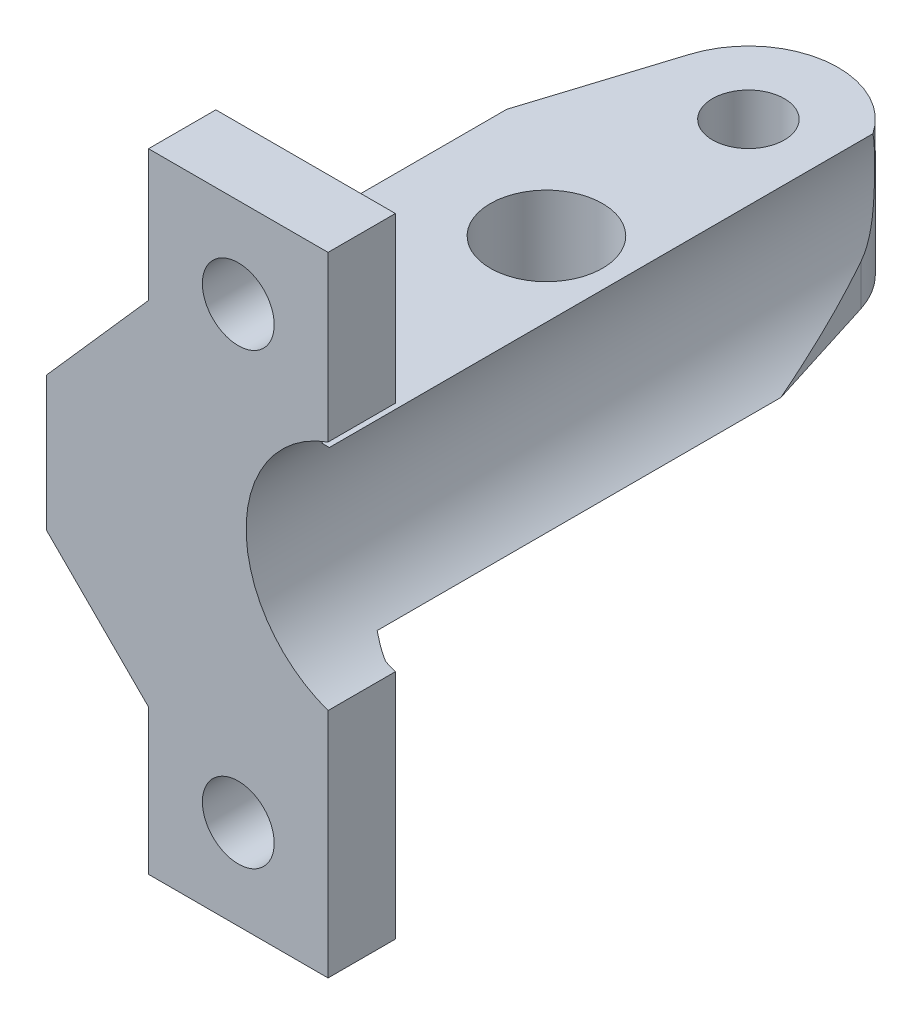
ISO-10303-21;
HEADER;
FILE_DESCRIPTION(('STEP AP214'),'2;1');
FILE_NAME('part.step','',(''),(''),'','','');
FILE_SCHEMA(('AUTOMOTIVE_DESIGN { 1 0 10303 214 1 1 1 1 }'));
ENDSEC;
DATA;
#1=APPLICATION_CONTEXT('core data for automotive mechanical design processes');
#2=APPLICATION_PROTOCOL_DEFINITION('international standard','automotive_design',2000,#1);
#3=PRODUCT_CONTEXT('',#1,'mechanical');
#4=PRODUCT('Part','Part','',(#3));
#5=PRODUCT_RELATED_PRODUCT_CATEGORY('part','',(#4));
#6=PRODUCT_DEFINITION_FORMATION('','',#4);
#7=PRODUCT_DEFINITION_CONTEXT('part definition',#1,'design');
#8=PRODUCT_DEFINITION('design','',#6,#7);
#9=PRODUCT_DEFINITION_SHAPE('','',#8);
#10=(LENGTH_UNIT() NAMED_UNIT(*) SI_UNIT(.MILLI.,.METRE.));
#11=(NAMED_UNIT(*) PLANE_ANGLE_UNIT() SI_UNIT($,.RADIAN.));
#12=(NAMED_UNIT(*) SI_UNIT($,.STERADIAN.) SOLID_ANGLE_UNIT());
#13=UNCERTAINTY_MEASURE_WITH_UNIT(LENGTH_MEASURE(1.E-05),#10,'distance_accuracy_value','');
#14=(GEOMETRIC_REPRESENTATION_CONTEXT(3) GLOBAL_UNCERTAINTY_ASSIGNED_CONTEXT((#13)) GLOBAL_UNIT_ASSIGNED_CONTEXT((#10,
#11,#12)) REPRESENTATION_CONTEXT('',''));
#15=CARTESIAN_POINT('',(0.,0.,0.));
#16=DIRECTION('',(0.,0.,1.));
#17=DIRECTION('',(1.,0.,0.));
#18=AXIS2_PLACEMENT_3D('',#15,#16,#17);
#19=CARTESIAN_POINT('',(0.,0.,3.));
#20=DIRECTION('',(-1.,0.,0.));
#21=DIRECTION('',(0.,-1.,0.));
#22=AXIS2_PLACEMENT_3D('',#19,#20,#21);
#23=PLANE('',#22);
#24=DIRECTION('',(0.,1.,0.));
#25=VECTOR('',#24,1.);
#26=CARTESIAN_POINT('',(0.,0.,0.));
#27=LINE('',#26,#25);
#28=CARTESIAN_POINT('',(0.,-28.,0.));
#29=VERTEX_POINT('',#28);
#30=CARTESIAN_POINT('',(0.,-17.6795270054321,0.));
#31=VERTEX_POINT('',#30);
#32=EDGE_CURVE('E199',#29,#31,#27,.T.);
#33=ORIENTED_EDGE('',*,*,#32,.T.);
#34=DIRECTION('',(0.,0.,1.));
#35=VECTOR('',#34,1.);
#36=CARTESIAN_POINT('',(0.,-17.6795270054321,-26.5));
#37=LINE('',#36,#35);
#38=CARTESIAN_POINT('',(0.,-17.6795270054321,3.));
#39=VERTEX_POINT('',#38);
#40=EDGE_CURVE('E130',#31,#39,#37,.T.);
#41=ORIENTED_EDGE('',*,*,#40,.T.);
#42=DIRECTION('',(0.,1.,0.));
#43=VECTOR('',#42,1.);
#44=CARTESIAN_POINT('',(0.,0.,3.));
#45=LINE('',#44,#43);
#46=CARTESIAN_POINT('',(0.,-28.,3.));
#47=VERTEX_POINT('',#46);
#48=EDGE_CURVE('E184',#47,#39,#45,.T.);
#49=ORIENTED_EDGE('',*,*,#48,.F.);
#50=DIRECTION('',(0.,0.,-1.));
#51=VECTOR('',#50,1.);
#52=CARTESIAN_POINT('',(0.,-28.,3.));
#53=LINE('',#52,#51);
#54=EDGE_CURVE('E198',#47,#29,#53,.T.);
#55=ORIENTED_EDGE('',*,*,#54,.T.);
#56=EDGE_LOOP('',(#33,#41,#49,#55));
#57=FACE_BOUND('',#56,.T.);
#58=ADVANCED_FACE('F37',(#57),#23,.F.);
#59=CARTESIAN_POINT('',(0.,0.,0.));
#60=DIRECTION('',(0.,0.,-1.));
#61=DIRECTION('',(-1.,0.,0.));
#62=AXIS2_PLACEMENT_3D('',#59,#60,#61);
#63=PLANE('',#62);
#64=CARTESIAN_POINT('',(-4.,-4.,0.));
#65=DIRECTION('',(0.,0.,-1.));
#66=DIRECTION('',(-1.,0.,0.));
#67=AXIS2_PLACEMENT_3D('',#64,#65,#66);
#68=CIRCLE('',#67,1.6);
#69=CARTESIAN_POINT('',(-5.6,-4.,0.));
#70=VERTEX_POINT('',#69);
#71=EDGE_CURVE('E581',#70,#70,#68,.T.);
#72=ORIENTED_EDGE('',*,*,#71,.F.);
#73=EDGE_LOOP('',(#72));
#74=FACE_BOUND('',#73,.T.);
#75=CARTESIAN_POINT('',(1.84999999999999,-12.5,0.));
#76=DIRECTION('',(0.,0.,-1.));
#77=DIRECTION('',(-1.,0.,0.));
#78=AXIS2_PLACEMENT_3D('',#75,#76,#77);
#79=CIRCLE('',#78,5.5);
#80=CARTESIAN_POINT('',(-3.2734753829798,-10.5,0.));
#81=VERTEX_POINT('',#80);
#82=CARTESIAN_POINT('',(0.,-7.32047299456794,0.));
#83=VERTEX_POINT('',#82);
#84=EDGE_CURVE('E120',#81,#83,#79,.T.);
#85=ORIENTED_EDGE('',*,*,#84,.F.);
#86=DIRECTION('',(-1.,0.,0.));
#87=VECTOR('',#86,1.);
#88=CARTESIAN_POINT('',(-12.54,-10.5,0.));
#89=LINE('',#88,#87);
#90=CARTESIAN_POINT('',(-12.0987401965084,-10.5,0.));
#91=VERTEX_POINT('',#90);
#92=EDGE_CURVE('E61',#81,#91,#89,.T.);
#93=ORIENTED_EDGE('',*,*,#92,.T.);
#94=DIRECTION('',(-0.661691894916747,-0.749775857307692,0.));
#95=VECTOR('',#94,1.);
#96=CARTESIAN_POINT('',(-12.54,-11.,0.));
#97=LINE('',#96,#95);
#98=CARTESIAN_POINT('',(-8.,-5.85563837440506,0.));
#99=VERTEX_POINT('',#98);
#100=EDGE_CURVE('E345',#99,#91,#97,.T.);
#101=ORIENTED_EDGE('',*,*,#100,.F.);
#102=DIRECTION('',(0.,-1.,0.));
#103=VECTOR('',#102,1.);
#104=CARTESIAN_POINT('',(-8.,0.,0.));
#105=LINE('',#104,#103);
#106=CARTESIAN_POINT('',(-8.,0.,0.));
#107=VERTEX_POINT('',#106);
#108=EDGE_CURVE('E206',#107,#99,#105,.T.);
#109=ORIENTED_EDGE('',*,*,#108,.F.);
#110=DIRECTION('',(-1.,0.,0.));
#111=VECTOR('',#110,1.);
#112=CARTESIAN_POINT('',(0.,0.,0.));
#113=LINE('',#112,#111);
#114=CARTESIAN_POINT('',(0.,0.,0.));
#115=VERTEX_POINT('',#114);
#116=EDGE_CURVE('E202',#115,#107,#113,.T.);
#117=ORIENTED_EDGE('',*,*,#116,.F.);
#118=EDGE_CURVE('E183',#83,#115,#27,.T.);
#119=ORIENTED_EDGE('',*,*,#118,.F.);
#120=EDGE_LOOP('',(#85,#93,#101,#109,#117,#119));
#121=FACE_BOUND('',#120,.T.);
#122=ADVANCED_FACE('F273',(#74,#121),#63,.T.);
#123=CARTESIAN_POINT('',(-8.,0.,3.));
#124=DIRECTION('',(1.,0.,0.));
#125=DIRECTION('',(0.,1.,0.));
#126=AXIS2_PLACEMENT_3D('',#123,#124,#125);
#127=PLANE('',#126);
#128=DIRECTION('',(0.,-1.,0.));
#129=VECTOR('',#128,1.);
#130=CARTESIAN_POINT('',(-8.,0.,3.));
#131=LINE('',#130,#129);
#132=CARTESIAN_POINT('',(-8.,-21.54,3.));
#133=VERTEX_POINT('',#132);
#134=CARTESIAN_POINT('',(-8.,-28.,3.));
#135=VERTEX_POINT('',#134);
#136=EDGE_CURVE('E191',#133,#135,#131,.T.);
#137=ORIENTED_EDGE('',*,*,#136,.F.);
#138=DIRECTION('',(0.,0.,1.));
#139=VECTOR('',#138,1.);
#140=CARTESIAN_POINT('',(-8.,-21.54,-16.3282209564433));
#141=LINE('',#140,#139);
#142=CARTESIAN_POINT('',(-8.,-21.54,0.));
#143=VERTEX_POINT('',#142);
#144=EDGE_CURVE('E336',#143,#133,#141,.T.);
#145=ORIENTED_EDGE('',*,*,#144,.F.);
#146=CARTESIAN_POINT('',(-8.,-28.,0.));
#147=VERTEX_POINT('',#146);
#148=EDGE_CURVE('E205',#143,#147,#105,.T.);
#149=ORIENTED_EDGE('',*,*,#148,.T.);
#150=DIRECTION('',(0.,0.,-1.));
#151=VECTOR('',#150,1.);
#152=CARTESIAN_POINT('',(-8.,-28.,3.));
#153=LINE('',#152,#151);
#154=EDGE_CURVE('E214',#135,#147,#153,.T.);
#155=ORIENTED_EDGE('',*,*,#154,.F.);
#156=EDGE_LOOP('',(#137,#145,#149,#155));
#157=FACE_BOUND('',#156,.T.);
#158=ADVANCED_FACE('F280',(#157),#127,.F.);
#159=CARTESIAN_POINT('',(0.,-7.32047299456794,3.));
#160=VERTEX_POINT('',#159);
#161=CARTESIAN_POINT('',(0.,0.,3.));
#162=VERTEX_POINT('',#161);
#163=EDGE_CURVE('E188',#160,#162,#45,.T.);
#164=ORIENTED_EDGE('',*,*,#163,.F.);
#165=DIRECTION('',(0.,0.,1.));
#166=VECTOR('',#165,1.);
#167=CARTESIAN_POINT('',(0.,-7.32047299456794,-26.5));
#168=LINE('',#167,#166);
#169=EDGE_CURVE('E127',#160,#83,#168,.F.);
#170=ORIENTED_EDGE('',*,*,#169,.T.);
#171=ORIENTED_EDGE('',*,*,#118,.T.);
#172=DIRECTION('',(0.,0.,-1.));
#173=VECTOR('',#172,1.);
#174=CARTESIAN_POINT('',(0.,0.,3.));
#175=LINE('',#174,#173);
#176=EDGE_CURVE('E220',#162,#115,#175,.T.);
#177=ORIENTED_EDGE('',*,*,#176,.F.);
#178=EDGE_LOOP('',(#164,#170,#171,#177));
#179=FACE_BOUND('',#178,.T.);
#180=ADVANCED_FACE('F276',(#179),#23,.F.);
#181=CARTESIAN_POINT('',(0.,0.,3.));
#182=DIRECTION('',(0.,-1.,0.));
#183=DIRECTION('',(1.,0.,0.));
#184=AXIS2_PLACEMENT_3D('',#181,#182,#183);
#185=PLANE('',#184);
#186=ORIENTED_EDGE('',*,*,#116,.T.);
#187=DIRECTION('',(0.,0.,-1.));
#188=VECTOR('',#187,1.);
#189=CARTESIAN_POINT('',(-8.,0.,3.));
#190=LINE('',#189,#188);
#191=CARTESIAN_POINT('',(-8.,0.,3.));
#192=VERTEX_POINT('',#191);
#193=EDGE_CURVE('E217',#192,#107,#190,.T.);
#194=ORIENTED_EDGE('',*,*,#193,.F.);
#195=DIRECTION('',(-1.,0.,0.));
#196=VECTOR('',#195,1.);
#197=CARTESIAN_POINT('',(0.,0.,3.));
#198=LINE('',#197,#196);
#199=EDGE_CURVE('E187',#162,#192,#198,.T.);
#200=ORIENTED_EDGE('',*,*,#199,.F.);
#201=ORIENTED_EDGE('',*,*,#176,.T.);
#202=EDGE_LOOP('',(#186,#194,#200,#201));
#203=FACE_BOUND('',#202,.T.);
#204=ADVANCED_FACE('F285',(#203),#185,.F.);
#205=ORIENTED_EDGE('',*,*,#108,.T.);
#206=DIRECTION('',(0.,0.,1.));
#207=VECTOR('',#206,1.);
#208=CARTESIAN_POINT('',(-8.,-5.85563837440506,-16.3282209564433));
#209=LINE('',#208,#207);
#210=CARTESIAN_POINT('',(-8.,-5.85563837440506,3.));
#211=VERTEX_POINT('',#210);
#212=EDGE_CURVE('E325',#99,#211,#209,.T.);
#213=ORIENTED_EDGE('',*,*,#212,.T.);
#214=EDGE_CURVE('E192',#192,#211,#131,.T.);
#215=ORIENTED_EDGE('',*,*,#214,.F.);
#216=ORIENTED_EDGE('',*,*,#193,.T.);
#217=EDGE_LOOP('',(#205,#213,#215,#216));
#218=FACE_BOUND('',#217,.T.);
#219=ADVANCED_FACE('F291',(#218),#127,.F.);
#220=CARTESIAN_POINT('',(0.,-28.,3.));
#221=DIRECTION('',(0.,1.,0.));
#222=DIRECTION('',(0.,0.,1.));
#223=AXIS2_PLACEMENT_3D('',#220,#221,#222);
#224=PLANE('',#223);
#225=DIRECTION('',(1.,0.,0.));
#226=VECTOR('',#225,1.);
#227=CARTESIAN_POINT('',(0.,-28.,0.));
#228=LINE('',#227,#226);
#229=EDGE_CURVE('E209',#147,#29,#228,.T.);
#230=ORIENTED_EDGE('',*,*,#229,.T.);
#231=ORIENTED_EDGE('',*,*,#54,.F.);
#232=DIRECTION('',(1.,0.,0.));
#233=VECTOR('',#232,1.);
#234=CARTESIAN_POINT('',(0.,-28.,3.));
#235=LINE('',#234,#233);
#236=EDGE_CURVE('E195',#135,#47,#235,.T.);
#237=ORIENTED_EDGE('',*,*,#236,.F.);
#238=ORIENTED_EDGE('',*,*,#154,.T.);
#239=EDGE_LOOP('',(#230,#231,#237,#238));
#240=FACE_BOUND('',#239,.T.);
#241=ADVANCED_FACE('F400',(#240),#224,.F.);
#242=CARTESIAN_POINT('',(0.,0.,3.));
#243=DIRECTION('',(0.,0.,-1.));
#244=DIRECTION('',(-1.,0.,0.));
#245=AXIS2_PLACEMENT_3D('',#242,#243,#244);
#246=PLANE('',#245);
#247=CARTESIAN_POINT('',(-4.,-4.,3.));
#248=DIRECTION('',(0.,0.,-1.));
#249=DIRECTION('',(-1.,0.,0.));
#250=AXIS2_PLACEMENT_3D('',#247,#248,#249);
#251=CIRCLE('',#250,1.6);
#252=CARTESIAN_POINT('',(-5.6,-4.,3.));
#253=VERTEX_POINT('',#252);
#254=EDGE_CURVE('E339',#253,#253,#251,.T.);
#255=ORIENTED_EDGE('',*,*,#254,.T.);
#256=EDGE_LOOP('',(#255));
#257=FACE_BOUND('',#256,.T.);
#258=CARTESIAN_POINT('',(-4.,-24.,3.));
#259=DIRECTION('',(0.,0.,-1.));
#260=DIRECTION('',(-1.,0.,0.));
#261=AXIS2_PLACEMENT_3D('',#258,#259,#260);
#262=CIRCLE('',#261,1.6);
#263=CARTESIAN_POINT('',(-5.6,-24.,3.));
#264=VERTEX_POINT('',#263);
#265=EDGE_CURVE('E580',#264,#264,#262,.T.);
#266=ORIENTED_EDGE('',*,*,#265,.T.);
#267=EDGE_LOOP('',(#266));
#268=FACE_BOUND('',#267,.T.);
#269=ORIENTED_EDGE('',*,*,#214,.T.);
#270=DIRECTION('',(-0.661691894916747,-0.749775857307692,0.));
#271=VECTOR('',#270,1.);
#272=CARTESIAN_POINT('',(-12.54,-11.,3.));
#273=LINE('',#272,#271);
#274=CARTESIAN_POINT('',(-12.54,-11.,3.));
#275=VERTEX_POINT('',#274);
#276=EDGE_CURVE('E329',#211,#275,#273,.T.);
#277=ORIENTED_EDGE('',*,*,#276,.T.);
#278=DIRECTION('',(0.,-1.,0.));
#279=VECTOR('',#278,1.);
#280=CARTESIAN_POINT('',(-12.54,-11.,3.));
#281=LINE('',#280,#279);
#282=CARTESIAN_POINT('',(-12.54,-17.,3.));
#283=VERTEX_POINT('',#282);
#284=EDGE_CURVE('E171',#275,#283,#281,.T.);
#285=ORIENTED_EDGE('',*,*,#284,.T.);
#286=DIRECTION('',(0.707106781186549,-0.707106781186546,0.));
#287=VECTOR('',#286,1.);
#288=CARTESIAN_POINT('',(-8.,-21.54,3.));
#289=LINE('',#288,#287);
#290=EDGE_CURVE('E334',#283,#133,#289,.T.);
#291=ORIENTED_EDGE('',*,*,#290,.T.);
#292=ORIENTED_EDGE('',*,*,#136,.T.);
#293=ORIENTED_EDGE('',*,*,#236,.T.);
#294=ORIENTED_EDGE('',*,*,#48,.T.);
#295=CARTESIAN_POINT('',(1.84999999999999,-12.5,3.));
#296=DIRECTION('',(0.,0.,-1.));
#297=DIRECTION('',(-1.,0.,0.));
#298=AXIS2_PLACEMENT_3D('',#295,#296,#297);
#299=CIRCLE('',#298,5.5);
#300=EDGE_CURVE('E133',#39,#160,#299,.T.);
#301=ORIENTED_EDGE('',*,*,#300,.T.);
#302=ORIENTED_EDGE('',*,*,#163,.T.);
#303=ORIENTED_EDGE('',*,*,#199,.T.);
#304=EDGE_LOOP('',(#269,#277,#285,#291,#292,#293,#294,#301,#302,#303));
#305=FACE_BOUND('',#304,.T.);
#306=ADVANCED_FACE('F308',(#257,#268,#305),#246,.F.);
#307=CARTESIAN_POINT('',(-4.,-24.,0.));
#308=DIRECTION('',(0.,0.,-1.));
#309=DIRECTION('',(-1.,0.,0.));
#310=AXIS2_PLACEMENT_3D('',#307,#308,#309);
#311=CIRCLE('',#310,1.6);
#312=CARTESIAN_POINT('',(-5.6,-24.,0.));
#313=VERTEX_POINT('',#312);
#314=EDGE_CURVE('E342',#313,#313,#311,.T.);
#315=ORIENTED_EDGE('',*,*,#314,.F.);
#316=EDGE_LOOP('',(#315));
#317=FACE_BOUND('',#316,.T.);
#318=DIRECTION('',(0.707106781186549,-0.707106781186546,0.));
#319=VECTOR('',#318,1.);
#320=CARTESIAN_POINT('',(-8.,-21.54,0.));
#321=LINE('',#320,#319);
#322=CARTESIAN_POINT('',(-12.04,-17.5,0.));
#323=VERTEX_POINT('',#322);
#324=EDGE_CURVE('E333',#323,#143,#321,.T.);
#325=ORIENTED_EDGE('',*,*,#324,.F.);
#326=DIRECTION('',(1.,0.,0.));
#327=VECTOR('',#326,1.);
#328=CARTESIAN_POINT('',(0.,-17.5,0.));
#329=LINE('',#328,#327);
#330=CARTESIAN_POINT('',(-0.441287847477915,-17.5,0.));
#331=VERTEX_POINT('',#330);
#332=EDGE_CURVE('E230',#323,#331,#329,.T.);
#333=ORIENTED_EDGE('',*,*,#332,.T.);
#334=EDGE_CURVE('E116',#31,#331,#79,.T.);
#335=ORIENTED_EDGE('',*,*,#334,.F.);
#336=ORIENTED_EDGE('',*,*,#32,.F.);
#337=ORIENTED_EDGE('',*,*,#229,.F.);
#338=ORIENTED_EDGE('',*,*,#148,.F.);
#339=EDGE_LOOP('',(#325,#333,#335,#336,#337,#338));
#340=FACE_BOUND('',#339,.T.);
#341=ADVANCED_FACE('F263',(#317,#340),#63,.T.);
#342=CARTESIAN_POINT('',(-6.77,-11.,-22.5));
#343=DIRECTION('',(0.,1.,0.));
#344=DIRECTION('',(-1.,0.,0.));
#345=AXIS2_PLACEMENT_3D('',#342,#343,#344);
#346=PLANE('',#345);
#347=DIRECTION('',(0.,0.,1.));
#348=VECTOR('',#347,1.);
#349=CARTESIAN_POINT('',(-12.54,-11.,-17.5));
#350=LINE('',#349,#348);
#351=CARTESIAN_POINT('',(-12.54,-11.,-17.5));
#352=VERTEX_POINT('',#351);
#353=CARTESIAN_POINT('',(-12.54,-11.,-0.5));
#354=VERTEX_POINT('',#353);
#355=EDGE_CURVE('E107',#352,#354,#350,.T.);
#356=ORIENTED_EDGE('',*,*,#355,.T.);
#357=DIRECTION('',(1.,0.,0.));
#358=VECTOR('',#357,1.);
#359=CARTESIAN_POINT('',(-3.44150262212918,-11.,-0.5));
#360=LINE('',#359,#358);
#361=CARTESIAN_POINT('',(-3.44150262212918,-11.,-0.500000000000007));
#362=VERTEX_POINT('',#361);
#363=EDGE_CURVE('E94',#354,#362,#360,.T.);
#364=ORIENTED_EDGE('',*,*,#363,.T.);
#365=DIRECTION('',(0.,0.,1.));
#366=VECTOR('',#365,1.);
#367=CARTESIAN_POINT('',(-3.44150262212918,-11.,-26.5));
#368=LINE('',#367,#366);
#369=CARTESIAN_POINT('',(-3.44150262212918,-11.,-24.7183564198539));
#370=VERTEX_POINT('',#369);
#371=EDGE_CURVE('E104',#370,#362,#368,.T.);
#372=ORIENTED_EDGE('',*,*,#371,.F.);
#373=CARTESIAN_POINT('',(-6.77,-11.,-22.5));
#374=DIRECTION('',(0.,1.,0.));
#375=DIRECTION('',(-1.,0.,0.));
#376=AXIS2_PLACEMENT_3D('',#373,#374,#375);
#377=CIRCLE('',#376,4.);
#378=CARTESIAN_POINT('',(-10.5849754645017,-11.,-23.702481686035));
#379=VERTEX_POINT('',#378);
#380=EDGE_CURVE('E166',#370,#379,#377,.T.);
#381=ORIENTED_EDGE('',*,*,#380,.T.);
#382=DIRECTION('',(-0.300620421508755,0.,0.953743866125438));
#383=VECTOR('',#382,1.);
#384=CARTESIAN_POINT('',(-10.5849754645017,-11.,-23.702481686035));
#385=LINE('',#384,#383);
#386=EDGE_CURVE('E168',#379,#352,#385,.T.);
#387=ORIENTED_EDGE('',*,*,#386,.T.);
#388=EDGE_LOOP('',(#356,#364,#372,#381,#387));
#389=FACE_BOUND('',#388,.T.);
#390=CARTESIAN_POINT('',(-6.77,-11.,-22.5));
#391=DIRECTION('',(0.,1.,0.));
#392=DIRECTION('',(-1.,0.,0.));
#393=AXIS2_PLACEMENT_3D('',#390,#391,#392);
#394=CIRCLE('',#393,1.6);
#395=CARTESIAN_POINT('',(-8.37,-11.,-22.5));
#396=VERTEX_POINT('',#395);
#397=EDGE_CURVE('E157',#396,#396,#394,.T.);
#398=ORIENTED_EDGE('',*,*,#397,.F.);
#399=EDGE_LOOP('',(#398));
#400=FACE_BOUND('',#399,.T.);
#401=CARTESIAN_POINT('',(-6.77,-11.,-4.5));
#402=DIRECTION('',(0.,1.,0.));
#403=DIRECTION('',(-1.,0.,0.));
#404=AXIS2_PLACEMENT_3D('',#401,#402,#403);
#405=CIRCLE('',#404,1.6);
#406=CARTESIAN_POINT('',(-8.37,-11.,-4.5));
#407=VERTEX_POINT('',#406);
#408=EDGE_CURVE('E163',#407,#407,#405,.T.);
#409=ORIENTED_EDGE('',*,*,#408,.F.);
#410=EDGE_LOOP('',(#409));
#411=FACE_BOUND('',#410,.T.);
#412=CARTESIAN_POINT('',(-6.77,-11.,-13.5));
#413=DIRECTION('',(0.,1.,0.));
#414=DIRECTION('',(-1.,0.,0.));
#415=AXIS2_PLACEMENT_3D('',#412,#413,#414);
#416=CIRCLE('',#415,2.49999999999999);
#417=CARTESIAN_POINT('',(-9.26999999999999,-11.,-13.5));
#418=VERTEX_POINT('',#417);
#419=EDGE_CURVE('E160',#418,#418,#416,.T.);
#420=ORIENTED_EDGE('',*,*,#419,.F.);
#421=EDGE_LOOP('',(#420));
#422=FACE_BOUND('',#421,.T.);
#423=ADVANCED_FACE('F100',(#389,#400,#411,#422),#346,.T.);
#424=CARTESIAN_POINT('',(-6.77,-17.,-22.5));
#425=DIRECTION('',(0.,1.,0.));
#426=DIRECTION('',(-1.,0.,0.));
#427=AXIS2_PLACEMENT_3D('',#424,#425,#426);
#428=PLANE('',#427);
#429=CARTESIAN_POINT('',(-6.77,-17.,-22.5));
#430=DIRECTION('',(0.,1.,0.));
#431=DIRECTION('',(-1.,0.,0.));
#432=AXIS2_PLACEMENT_3D('',#429,#430,#431);
#433=CIRCLE('',#432,1.6);
#434=CARTESIAN_POINT('',(-8.37,-17.,-22.5));
#435=VERTEX_POINT('',#434);
#436=EDGE_CURVE('E136',#435,#435,#433,.T.);
#437=ORIENTED_EDGE('',*,*,#436,.T.);
#438=EDGE_LOOP('',(#437));
#439=FACE_BOUND('',#438,.T.);
#440=CARTESIAN_POINT('',(-6.76999999999999,-17.,-13.5));
#441=DIRECTION('',(0.,1.,0.));
#442=DIRECTION('',(-1.,0.,0.));
#443=AXIS2_PLACEMENT_3D('',#440,#441,#442);
#444=CIRCLE('',#443,2.49999999999999);
#445=CARTESIAN_POINT('',(-9.26999999999999,-17.,-13.5));
#446=VERTEX_POINT('',#445);
#447=EDGE_CURVE('E139',#446,#446,#444,.T.);
#448=ORIENTED_EDGE('',*,*,#447,.T.);
#449=EDGE_LOOP('',(#448));
#450=FACE_BOUND('',#449,.T.);
#451=CARTESIAN_POINT('',(-6.76999999999999,-17.,-4.5));
#452=DIRECTION('',(0.,1.,0.));
#453=DIRECTION('',(-1.,0.,0.));
#454=AXIS2_PLACEMENT_3D('',#451,#452,#453);
#455=CIRCLE('',#454,1.6);
#456=CARTESIAN_POINT('',(-8.36999999999999,-17.,-4.5));
#457=VERTEX_POINT('',#456);
#458=EDGE_CURVE('E142',#457,#457,#455,.T.);
#459=ORIENTED_EDGE('',*,*,#458,.T.);
#460=EDGE_LOOP('',(#459));
#461=FACE_BOUND('',#460,.T.);
#462=DIRECTION('',(0.,0.,1.));
#463=VECTOR('',#462,1.);
#464=CARTESIAN_POINT('',(-1.31227766016838,-17.,-26.5));
#465=LINE('',#464,#463);
#466=CARTESIAN_POINT('',(-1.31227766016838,-17.,-18.4907274476525));
#467=VERTEX_POINT('',#466);
#468=CARTESIAN_POINT('',(-1.31227766016838,-17.,-0.5));
#469=VERTEX_POINT('',#468);
#470=EDGE_CURVE('E117',#467,#469,#465,.T.);
#471=ORIENTED_EDGE('',*,*,#470,.T.);
#472=DIRECTION('',(-1.,0.,0.));
#473=VECTOR('',#472,1.);
#474=CARTESIAN_POINT('',(-6.77,-17.,-0.499999999999994));
#475=LINE('',#474,#473);
#476=CARTESIAN_POINT('',(-12.54,-17.,-0.499999999999994));
#477=VERTEX_POINT('',#476);
#478=EDGE_CURVE('E108',#469,#477,#475,.T.);
#479=ORIENTED_EDGE('',*,*,#478,.T.);
#480=DIRECTION('',(0.,0.,1.));
#481=VECTOR('',#480,1.);
#482=CARTESIAN_POINT('',(-12.54,-17.,-17.5));
#483=LINE('',#482,#481);
#484=CARTESIAN_POINT('',(-12.54,-17.,-17.5));
#485=VERTEX_POINT('',#484);
#486=EDGE_CURVE('E154',#485,#477,#483,.T.);
#487=ORIENTED_EDGE('',*,*,#486,.F.);
#488=DIRECTION('',(-0.300620421508755,0.,0.953743866125438));
#489=VECTOR('',#488,1.);
#490=CARTESIAN_POINT('',(-10.5849754645017,-17.,-23.702481686035));
#491=LINE('',#490,#489);
#492=CARTESIAN_POINT('',(-10.5849754645017,-17.,-23.702481686035));
#493=VERTEX_POINT('',#492);
#494=EDGE_CURVE('E151',#493,#485,#491,.T.);
#495=ORIENTED_EDGE('',*,*,#494,.F.);
#496=CARTESIAN_POINT('',(-6.77,-17.,-22.5));
#497=DIRECTION('',(0.,1.,0.));
#498=DIRECTION('',(-1.,0.,0.));
#499=AXIS2_PLACEMENT_3D('',#496,#497,#498);
#500=CIRCLE('',#499,4.);
#501=CARTESIAN_POINT('',(-2.95502453549824,-17.,-23.702481686035));
#502=VERTEX_POINT('',#501);
#503=EDGE_CURVE('E148',#502,#493,#500,.T.);
#504=ORIENTED_EDGE('',*,*,#503,.F.);
#505=DIRECTION('',(-0.300620421508756,0.,-0.953743866125438));
#506=VECTOR('',#505,1.);
#507=CARTESIAN_POINT('',(-0.999999999999997,-17.,-17.5));
#508=LINE('',#507,#506);
#509=EDGE_CURVE('E145',#467,#502,#508,.T.);
#510=ORIENTED_EDGE('',*,*,#509,.F.);
#511=EDGE_LOOP('',(#471,#479,#487,#495,#504,#510));
#512=FACE_BOUND('',#511,.T.);
#513=ADVANCED_FACE('F244',(#439,#450,#461,#512),#428,.F.);
#514=CARTESIAN_POINT('',(-0.999999999999999,-11.,-17.5));
#515=DIRECTION('',(-0.953743866125438,0.,0.300620421508756));
#516=DIRECTION('',(0.300620421508756,0.,0.953743866125438));
#517=AXIS2_PLACEMENT_3D('',#514,#515,#516);
#518=PLANE('',#517);
#519=DIRECTION('',(0.,-1.,0.));
#520=VECTOR('',#519,1.);
#521=CARTESIAN_POINT('',(-2.95502453549824,-11.,-23.702481686035));
#522=LINE('',#521,#520);
#523=CARTESIAN_POINT('',(-2.95502453549824,-15.176142599575,-23.702481686035));
#524=VERTEX_POINT('',#523);
#525=EDGE_CURVE('E180',#524,#502,#522,.T.);
#526=ORIENTED_EDGE('',*,*,#525,.F.);
#527=CARTESIAN_POINT('',(1.84999999999999,-12.5,-8.4581325020585));
#528=DIRECTION('',(-0.953743866125438,0.,0.300620421508756));
#529=DIRECTION('',(0.300620421508756,0.,0.953743866125438));
#530=AXIS2_PLACEMENT_3D('',#527,#528,#529);
#531=ELLIPSE('',#530,18.2954969339627,5.5);
#532=EDGE_CURVE('E123',#524,#467,#531,.T.);
#533=ORIENTED_EDGE('',*,*,#532,.T.);
#534=ORIENTED_EDGE('',*,*,#509,.T.);
#535=EDGE_LOOP('',(#526,#533,#534));
#536=FACE_BOUND('',#535,.T.);
#537=ADVANCED_FACE('F247',(#536),#518,.F.);
#538=CARTESIAN_POINT('',(-6.77,-11.,-22.5));
#539=DIRECTION('',(0.,-1.,0.));
#540=DIRECTION('',(1.,0.,0.));
#541=AXIS2_PLACEMENT_3D('',#538,#539,#540);
#542=CYLINDRICAL_SURFACE('',#541,4.);
#543=ORIENTED_EDGE('',*,*,#380,.F.);
#544=CARTESIAN_POINT('',(-3.44150262212918,-11.,-24.7183564198539));
#545=CARTESIAN_POINT('',(-3.46516094633566,-11.0833725545341,-24.7538103868176));
#546=CARTESIAN_POINT('',(-3.48719375141667,-11.1686898204059,-24.7856832386912));
#547=CARTESIAN_POINT('',(-3.52752580960531,-11.342377712215,-24.8425686047035));
#548=CARTESIAN_POINT('',(-3.54582749368501,-11.430746305914,-24.8675855893909));
#549=CARTESIAN_POINT('',(-3.57821323853083,-11.6096256233748,-24.9110613670056));
#550=CARTESIAN_POINT('',(-3.59230599127985,-11.7001315100931,-24.9295336904112));
#551=CARTESIAN_POINT('',(-3.61603313592935,-11.8827808128003,-24.9602587994011));
#552=CARTESIAN_POINT('',(-3.62566677059661,-11.9749245041594,-24.9725105286581));
#553=CARTESIAN_POINT('',(-3.64025904278731,-12.1599332509532,-24.9909553076002));
#554=CARTESIAN_POINT('',(-3.64522992528524,-12.252795767582,-24.9971642280841));
#555=CARTESIAN_POINT('',(-3.65044874786329,-12.4389015912985,-25.0036808172291));
#556=CARTESIAN_POINT('',(-3.65069452447649,-12.5321450532663,-25.0039857826685));
#557=CARTESIAN_POINT('',(-3.64645032279678,-12.7184646411019,-24.9986894558626));
#558=CARTESIAN_POINT('',(-3.64195489610893,-12.8115404510614,-24.9930813685835));
#559=CARTESIAN_POINT('',(-3.62830799794692,-12.9967491239546,-24.9758618412454));
#560=CARTESIAN_POINT('',(-3.61915868205164,-13.0888824033117,-24.9642531804794));
#561=CARTESIAN_POINT('',(-3.59599386715002,-13.2747357992925,-24.9343491916034));
#562=CARTESIAN_POINT('',(-3.58182235826242,-13.3684021024636,-24.9158383574431));
#563=CARTESIAN_POINT('',(-3.54901260404449,-13.5533195265768,-24.8719172252601));
#564=CARTESIAN_POINT('',(-3.53037392283584,-13.6445704108722,-24.8465062539335));
#565=CARTESIAN_POINT('',(-3.48911921675749,-13.8237218860376,-24.7884684269164));
#566=CARTESIAN_POINT('',(-3.46650761208491,-13.9116260695006,-24.7558495802828));
#567=CARTESIAN_POINT('',(-3.41795246480191,-14.0832370112752,-24.6830453652159));
#568=CARTESIAN_POINT('',(-3.39201007010039,-14.1669452019203,-24.6428626013646));
#569=CARTESIAN_POINT('',(-3.32336298697544,-14.3716923668324,-24.5314895612423));
#570=CARTESIAN_POINT('',(-3.27897979501203,-14.4893966172332,-24.455065202951));
#571=CARTESIAN_POINT('',(-3.18827612374855,-14.7090444113865,-24.283422658602));
#572=CARTESIAN_POINT('',(-3.14196055544545,-14.8110251442673,-24.1882500701504));
#573=CARTESIAN_POINT('',(-3.07194421250527,-14.9551574603202,-24.025910510777));
#574=CARTESIAN_POINT('',(-3.04727492035593,-15.0038651586432,-23.9648934518493));
#575=CARTESIAN_POINT('',(-2.9996449992643,-15.0949143101636,-23.8375610007877));
#576=CARTESIAN_POINT('',(-2.97668624319566,-15.1372488356202,-23.7712399613099));
#577=CARTESIAN_POINT('',(-2.95502453549824,-15.176142599575,-23.702481686035));
#578=B_SPLINE_CURVE_WITH_KNOTS('',3,(#544,#545,#546,#547,#548,#549,#550,#551,#552,#553,#554,
#555,#556,#557,#558,#559,#560,#561,#562,#563,#564,#565,#566,#567,#568,#569,#570,#571,#572,#573,
#574,#575,#576,#577),.UNSPECIFIED.,.F.,.F.,(4,2,2,2,2,2,2,2,2,2,2,2,2,2,2,2,4),(0.,
0.280755460891463,0.561327409802096,0.841315870218372,1.12135185995497,1.40065036389852,
1.68007674618062,1.9598245839493,2.23944296651406,2.52864328027436,2.81787182386207,
3.1067805918406,3.3955900574972,3.83522870975371,4.27381103118738,4.51904812134713,
4.76454989262239),.UNSPECIFIED.);
#579=EDGE_CURVE('E115',#370,#524,#578,.T.);
#580=ORIENTED_EDGE('',*,*,#579,.T.);
#581=ORIENTED_EDGE('',*,*,#525,.T.);
#582=ORIENTED_EDGE('',*,*,#503,.T.);
#583=DIRECTION('',(0.,-1.,0.));
#584=VECTOR('',#583,1.);
#585=CARTESIAN_POINT('',(-10.5849754645017,-11.,-23.702481686035));
#586=LINE('',#585,#584);
#587=EDGE_CURVE('E177',#379,#493,#586,.T.);
#588=ORIENTED_EDGE('',*,*,#587,.F.);
#589=EDGE_LOOP('',(#543,#580,#581,#582,#588));
#590=FACE_BOUND('',#589,.T.);
#591=ADVANCED_FACE('F232',(#590),#542,.T.);
#592=CARTESIAN_POINT('',(-10.5849754645017,-11.,-23.702481686035));
#593=DIRECTION('',(0.953743866125438,0.,0.300620421508755));
#594=DIRECTION('',(0.300620421508755,0.,-0.953743866125438));
#595=AXIS2_PLACEMENT_3D('',#592,#593,#594);
#596=PLANE('',#595);
#597=ORIENTED_EDGE('',*,*,#587,.T.);
#598=ORIENTED_EDGE('',*,*,#494,.T.);
#599=DIRECTION('',(0.,-1.,0.));
#600=VECTOR('',#599,1.);
#601=CARTESIAN_POINT('',(-12.54,-11.,-17.5));
#602=LINE('',#601,#600);
#603=EDGE_CURVE('E174',#352,#485,#602,.T.);
#604=ORIENTED_EDGE('',*,*,#603,.F.);
#605=ORIENTED_EDGE('',*,*,#386,.F.);
#606=EDGE_LOOP('',(#597,#598,#604,#605));
#607=FACE_BOUND('',#606,.T.);
#608=ADVANCED_FACE('F265',(#607),#596,.F.);
#609=CARTESIAN_POINT('',(-12.54,-11.,3.));
#610=DIRECTION('',(1.,0.,0.));
#611=DIRECTION('',(0.,1.,0.));
#612=AXIS2_PLACEMENT_3D('',#609,#610,#611);
#613=PLANE('',#612);
#614=ORIENTED_EDGE('',*,*,#486,.T.);
#615=DIRECTION('',(0.,0.,1.));
#616=VECTOR('',#615,1.);
#617=CARTESIAN_POINT('',(-12.54,-17.,-16.3282209564433));
#618=LINE('',#617,#616);
#619=EDGE_CURVE('E75',#477,#283,#618,.T.);
#620=ORIENTED_EDGE('',*,*,#619,.T.);
#621=ORIENTED_EDGE('',*,*,#284,.F.);
#622=DIRECTION('',(0.,0.,1.));
#623=VECTOR('',#622,1.);
#624=CARTESIAN_POINT('',(-12.54,-11.,-16.3282209564433));
#625=LINE('',#624,#623);
#626=EDGE_CURVE('E52',#354,#275,#625,.T.);
#627=ORIENTED_EDGE('',*,*,#626,.F.);
#628=ORIENTED_EDGE('',*,*,#355,.F.);
#629=ORIENTED_EDGE('',*,*,#603,.T.);
#630=EDGE_LOOP('',(#614,#620,#621,#627,#628,#629));
#631=FACE_BOUND('',#630,.T.);
#632=ADVANCED_FACE('F259',(#631),#613,.F.);
#633=CARTESIAN_POINT('',(-6.77,-11.,-4.5));
#634=DIRECTION('',(0.,-1.,0.));
#635=DIRECTION('',(1.,0.,0.));
#636=AXIS2_PLACEMENT_3D('',#633,#634,#635);
#637=CYLINDRICAL_SURFACE('',#636,1.6);
#638=ORIENTED_EDGE('',*,*,#408,.T.);
#639=EDGE_LOOP('',(#638));
#640=FACE_BOUND('',#639,.T.);
#641=ORIENTED_EDGE('',*,*,#458,.F.);
#642=EDGE_LOOP('',(#641));
#643=FACE_BOUND('',#642,.T.);
#644=ADVANCED_FACE('F255',(#640,#643),#637,.F.);
#645=CARTESIAN_POINT('',(-6.77,-11.,-13.5));
#646=DIRECTION('',(0.,-1.,0.));
#647=DIRECTION('',(1.,0.,0.));
#648=AXIS2_PLACEMENT_3D('',#645,#646,#647);
#649=CYLINDRICAL_SURFACE('',#648,2.49999999999999);
#650=ORIENTED_EDGE('',*,*,#419,.T.);
#651=EDGE_LOOP('',(#650));
#652=FACE_BOUND('',#651,.T.);
#653=ORIENTED_EDGE('',*,*,#447,.F.);
#654=EDGE_LOOP('',(#653));
#655=FACE_BOUND('',#654,.T.);
#656=ADVANCED_FACE('F251',(#652,#655),#649,.F.);
#657=CARTESIAN_POINT('',(-6.77,-11.,-22.5));
#658=DIRECTION('',(0.,-1.,0.));
#659=DIRECTION('',(1.,0.,0.));
#660=AXIS2_PLACEMENT_3D('',#657,#658,#659);
#661=CYLINDRICAL_SURFACE('',#660,1.6);
#662=ORIENTED_EDGE('',*,*,#397,.T.);
#663=EDGE_LOOP('',(#662));
#664=FACE_BOUND('',#663,.T.);
#665=ORIENTED_EDGE('',*,*,#436,.F.);
#666=EDGE_LOOP('',(#665));
#667=FACE_BOUND('',#666,.T.);
#668=ADVANCED_FACE('F241',(#664,#667),#661,.F.);
#669=CARTESIAN_POINT('',(1.84999999999999,-12.5,-26.5));
#670=DIRECTION('',(0.,0.,1.));
#671=DIRECTION('',(1.,0.,0.));
#672=AXIS2_PLACEMENT_3D('',#669,#670,#671);
#673=CYLINDRICAL_SURFACE('',#672,5.5);
#674=ORIENTED_EDGE('',*,*,#40,.F.);
#675=ORIENTED_EDGE('',*,*,#334,.T.);
#676=CARTESIAN_POINT('',(1.84999999999999,-12.5,-4.99999999999988));
#677=DIRECTION('',(0.,0.707106781186539,0.707106781186556));
#678=DIRECTION('',(0.,-0.707106781186556,0.707106781186539));
#679=AXIS2_PLACEMENT_3D('',#676,#677,#678);
#680=ELLIPSE('',#679,7.77817459305193,5.5);
#681=EDGE_CURVE('E406',#331,#469,#680,.F.);
#682=ORIENTED_EDGE('',*,*,#681,.T.);
#683=ORIENTED_EDGE('',*,*,#470,.F.);
#684=ORIENTED_EDGE('',*,*,#532,.F.);
#685=ORIENTED_EDGE('',*,*,#579,.F.);
#686=ORIENTED_EDGE('',*,*,#371,.T.);
#687=CARTESIAN_POINT('',(1.84999999999999,-12.5,-2.00000000000001));
#688=DIRECTION('',(0.,0.70710678118655,-0.707106781186545));
#689=DIRECTION('',(0.,0.707106781186545,0.70710678118655));
#690=AXIS2_PLACEMENT_3D('',#687,#688,#689);
#691=ELLIPSE('',#690,7.77817459305205,5.5);
#692=EDGE_CURVE('E45',#362,#81,#691,.T.);
#693=ORIENTED_EDGE('',*,*,#692,.T.);
#694=ORIENTED_EDGE('',*,*,#84,.T.);
#695=ORIENTED_EDGE('',*,*,#169,.F.);
#696=ORIENTED_EDGE('',*,*,#300,.F.);
#697=EDGE_LOOP('',(#674,#675,#682,#683,#684,#685,#686,#693,#694,#695,#696));
#698=FACE_BOUND('',#697,.T.);
#699=ADVANCED_FACE('F112',(#698),#673,.F.);
#700=CARTESIAN_POINT('',(-12.54,-11.,-16.3282209564433));
#701=DIRECTION('',(-0.749775857307692,0.661691894916747,0.));
#702=DIRECTION('',(-0.661691894916747,-0.749775857307692,0.));
#703=AXIS2_PLACEMENT_3D('',#700,#701,#702);
#704=PLANE('',#703);
#705=ORIENTED_EDGE('',*,*,#212,.F.);
#706=ORIENTED_EDGE('',*,*,#100,.T.);
#707=DIRECTION('',(0.529410468959799,0.599885220419607,0.599885220419611));
#708=VECTOR('',#707,1.);
#709=CARTESIAN_POINT('',(-10.9228106844028,-9.16753157346244,1.33246842653758));
#710=LINE('',#709,#708);
#711=EDGE_CURVE('E11',#91,#354,#710,.F.);
#712=ORIENTED_EDGE('',*,*,#711,.T.);
#713=ORIENTED_EDGE('',*,*,#626,.T.);
#714=ORIENTED_EDGE('',*,*,#276,.F.);
#715=EDGE_LOOP('',(#705,#706,#712,#713,#714));
#716=FACE_BOUND('',#715,.T.);
#717=ADVANCED_FACE('F240',(#716),#704,.T.);
#718=CARTESIAN_POINT('',(-8.,-21.54,-16.3282209564433));
#719=DIRECTION('',(-0.707106781186546,-0.707106781186549,0.));
#720=DIRECTION('',(0.707106781186549,-0.707106781186546,0.));
#721=AXIS2_PLACEMENT_3D('',#718,#719,#720);
#722=PLANE('',#721);
#723=ORIENTED_EDGE('',*,*,#619,.F.);
#724=DIRECTION('',(0.577350269189632,-0.577350269189629,0.577350269189616));
#725=VECTOR('',#724,1.);
#726=CARTESIAN_POINT('',(-8.02666666666657,-21.5133333333334,4.0133333333333));
#727=LINE('',#726,#725);
#728=EDGE_CURVE('E83',#477,#323,#727,.T.);
#729=ORIENTED_EDGE('',*,*,#728,.T.);
#730=ORIENTED_EDGE('',*,*,#324,.T.);
#731=ORIENTED_EDGE('',*,*,#144,.T.);
#732=ORIENTED_EDGE('',*,*,#290,.F.);
#733=EDGE_LOOP('',(#723,#729,#730,#731,#732));
#734=FACE_BOUND('',#733,.T.);
#735=ADVANCED_FACE('F242',(#734),#722,.T.);
#736=CARTESIAN_POINT('',(-4.,-24.,3.));
#737=DIRECTION('',(0.,0.,-1.));
#738=DIRECTION('',(-1.,0.,0.));
#739=AXIS2_PLACEMENT_3D('',#736,#737,#738);
#740=CYLINDRICAL_SURFACE('',#739,1.6);
#741=ORIENTED_EDGE('',*,*,#265,.F.);
#742=EDGE_LOOP('',(#741));
#743=FACE_BOUND('',#742,.T.);
#744=ORIENTED_EDGE('',*,*,#314,.T.);
#745=EDGE_LOOP('',(#744));
#746=FACE_BOUND('',#745,.T.);
#747=ADVANCED_FACE('F419',(#743,#746),#740,.F.);
#748=CARTESIAN_POINT('',(-4.,-4.,3.));
#749=DIRECTION('',(0.,0.,-1.));
#750=DIRECTION('',(-1.,0.,0.));
#751=AXIS2_PLACEMENT_3D('',#748,#749,#750);
#752=CYLINDRICAL_SURFACE('',#751,1.6);
#753=ORIENTED_EDGE('',*,*,#254,.F.);
#754=EDGE_LOOP('',(#753));
#755=FACE_BOUND('',#754,.T.);
#756=ORIENTED_EDGE('',*,*,#71,.T.);
#757=EDGE_LOOP('',(#756));
#758=FACE_BOUND('',#757,.T.);
#759=ADVANCED_FACE('F414',(#755,#758),#752,.F.);
#760=CARTESIAN_POINT('',(0.,-17.5,0.));
#761=DIRECTION('',(0.,0.707106781186539,0.707106781186556));
#762=DIRECTION('',(1.,0.,0.));
#763=AXIS2_PLACEMENT_3D('',#760,#761,#762);
#764=PLANE('',#763);
#765=ORIENTED_EDGE('',*,*,#728,.F.);
#766=ORIENTED_EDGE('',*,*,#478,.F.);
#767=ORIENTED_EDGE('',*,*,#681,.F.);
#768=ORIENTED_EDGE('',*,*,#332,.F.);
#769=EDGE_LOOP('',(#765,#766,#767,#768));
#770=FACE_BOUND('',#769,.T.);
#771=ADVANCED_FACE('F412',(#770),#764,.F.);
#772=CARTESIAN_POINT('',(-6.77,-11.,-0.5));
#773=DIRECTION('',(0.,0.70710678118655,-0.707106781186545));
#774=DIRECTION('',(-1.,0.,0.));
#775=AXIS2_PLACEMENT_3D('',#772,#773,#774);
#776=PLANE('',#775);
#777=ORIENTED_EDGE('',*,*,#711,.F.);
#778=ORIENTED_EDGE('',*,*,#92,.F.);
#779=ORIENTED_EDGE('',*,*,#692,.F.);
#780=ORIENTED_EDGE('',*,*,#363,.F.);
#781=EDGE_LOOP('',(#777,#778,#779,#780));
#782=FACE_BOUND('',#781,.T.);
#783=ADVANCED_FACE('F39',(#782),#776,.T.);
#784=CLOSED_SHELL('',(#58,#122,#158,#180,#204,#219,#241,#306,#341,#423,#513,#537,#591,#608,#632,
#644,#656,#668,#699,#717,#735,#747,#759,#771,#783));
#785=MANIFOLD_SOLID_BREP('B2',#784);
#786=ADVANCED_BREP_SHAPE_REPRESENTATION('',(#18,#785),#14);
#787=SHAPE_DEFINITION_REPRESENTATION(#9,#786);
ENDSEC;
END-ISO-10303-21;
